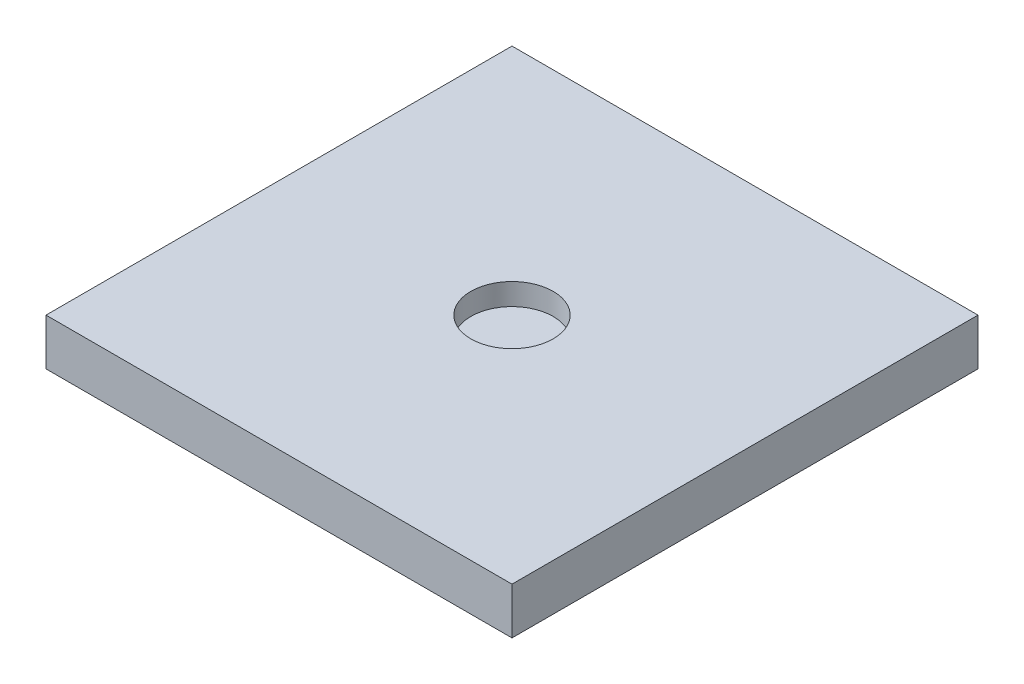
ISO-10303-21;
HEADER;
FILE_DESCRIPTION(('STEP AP214'),'2;1');
FILE_NAME('part.step','',(''),(''),'','','');
FILE_SCHEMA(('AUTOMOTIVE_DESIGN { 1 0 10303 214 1 1 1 1 }'));
ENDSEC;
DATA;
#1=APPLICATION_CONTEXT('core data for automotive mechanical design processes');
#2=APPLICATION_PROTOCOL_DEFINITION('international standard','automotive_design',2000,#1);
#3=PRODUCT_CONTEXT('',#1,'mechanical');
#4=PRODUCT('Part','Part','',(#3));
#5=PRODUCT_RELATED_PRODUCT_CATEGORY('part','',(#4));
#6=PRODUCT_DEFINITION_FORMATION('','',#4);
#7=PRODUCT_DEFINITION_CONTEXT('part definition',#1,'design');
#8=PRODUCT_DEFINITION('design','',#6,#7);
#9=PRODUCT_DEFINITION_SHAPE('','',#8);
#10=(LENGTH_UNIT() NAMED_UNIT(*) SI_UNIT(.MILLI.,.METRE.));
#11=(NAMED_UNIT(*) PLANE_ANGLE_UNIT() SI_UNIT($,.RADIAN.));
#12=(NAMED_UNIT(*) SI_UNIT($,.STERADIAN.) SOLID_ANGLE_UNIT());
#13=UNCERTAINTY_MEASURE_WITH_UNIT(LENGTH_MEASURE(1.E-05),#10,'distance_accuracy_value','');
#14=(GEOMETRIC_REPRESENTATION_CONTEXT(3) GLOBAL_UNCERTAINTY_ASSIGNED_CONTEXT((#13)) GLOBAL_UNIT_ASSIGNED_CONTEXT((#10,
#11,#12)) REPRESENTATION_CONTEXT('',''));
#15=CARTESIAN_POINT('',(0.,0.,0.));
#16=DIRECTION('',(0.,0.,1.));
#17=DIRECTION('',(1.,0.,0.));
#18=AXIS2_PLACEMENT_3D('',#15,#16,#17);
#19=CARTESIAN_POINT('',(0.,15.,0.));
#20=DIRECTION('',(0.,-1.,0.));
#21=DIRECTION('',(0.,0.,-1.));
#22=AXIS2_PLACEMENT_3D('',#19,#20,#21);
#23=CYLINDRICAL_SURFACE('',#22,13.25);
#24=CARTESIAN_POINT('',(0.,15.,0.));
#25=DIRECTION('',(0.,1.,0.));
#26=DIRECTION('',(0.,0.,1.));
#27=AXIS2_PLACEMENT_3D('',#24,#25,#26);
#28=CIRCLE('',#27,13.25);
#29=CARTESIAN_POINT('',(0.,15.,13.25));
#30=VERTEX_POINT('',#29);
#31=EDGE_CURVE('E101',#30,#30,#28,.T.);
#32=ORIENTED_EDGE('',*,*,#31,.T.);
#33=EDGE_LOOP('',(#32));
#34=FACE_BOUND('',#33,.T.);
#35=CARTESIAN_POINT('',(0.,8.,0.));
#36=DIRECTION('',(0.,-1.,0.));
#37=DIRECTION('',(0.,0.,-1.));
#38=AXIS2_PLACEMENT_3D('',#35,#36,#37);
#39=CIRCLE('',#38,13.25);
#40=CARTESIAN_POINT('',(0.,8.,-13.25));
#41=VERTEX_POINT('',#40);
#42=EDGE_CURVE('E114',#41,#41,#39,.T.);
#43=ORIENTED_EDGE('',*,*,#42,.T.);
#44=EDGE_LOOP('',(#43));
#45=FACE_BOUND('',#44,.T.);
#46=ADVANCED_FACE('F33',(#34,#45),#23,.F.);
#47=CARTESIAN_POINT('',(0.,15.,0.));
#48=DIRECTION('',(0.,-1.,0.));
#49=DIRECTION('',(0.,0.,-1.));
#50=AXIS2_PLACEMENT_3D('',#47,#48,#49);
#51=PLANE('',#50);
#52=DIRECTION('',(0.,0.,-1.));
#53=VECTOR('',#52,1.);
#54=CARTESIAN_POINT('',(75.,15.,75.));
#55=LINE('',#54,#53);
#56=CARTESIAN_POINT('',(75.,15.,75.));
#57=VERTEX_POINT('',#56);
#58=CARTESIAN_POINT('',(75.,15.,-75.));
#59=VERTEX_POINT('',#58);
#60=EDGE_CURVE('E86',#57,#59,#55,.T.);
#61=ORIENTED_EDGE('',*,*,#60,.T.);
#62=DIRECTION('',(-1.,0.,0.));
#63=VECTOR('',#62,1.);
#64=CARTESIAN_POINT('',(-75.,15.,-75.));
#65=LINE('',#64,#63);
#66=CARTESIAN_POINT('',(-75.,15.,-75.));
#67=VERTEX_POINT('',#66);
#68=EDGE_CURVE('E80',#59,#67,#65,.T.);
#69=ORIENTED_EDGE('',*,*,#68,.T.);
#70=DIRECTION('',(0.,0.,1.));
#71=VECTOR('',#70,1.);
#72=CARTESIAN_POINT('',(-75.,15.,75.));
#73=LINE('',#72,#71);
#74=CARTESIAN_POINT('',(-75.,15.,75.));
#75=VERTEX_POINT('',#74);
#76=EDGE_CURVE('E84',#67,#75,#73,.T.);
#77=ORIENTED_EDGE('',*,*,#76,.T.);
#78=DIRECTION('',(1.,0.,0.));
#79=VECTOR('',#78,1.);
#80=CARTESIAN_POINT('',(-75.,15.,75.));
#81=LINE('',#80,#79);
#82=EDGE_CURVE('E50',#75,#57,#81,.T.);
#83=ORIENTED_EDGE('',*,*,#82,.T.);
#84=EDGE_LOOP('',(#61,#69,#77,#83));
#85=FACE_BOUND('',#84,.T.);
#86=ORIENTED_EDGE('',*,*,#31,.F.);
#87=EDGE_LOOP('',(#86));
#88=FACE_BOUND('',#87,.T.);
#89=ADVANCED_FACE('F81',(#85,#88),#51,.F.);
#90=CARTESIAN_POINT('',(0.,0.,0.));
#91=DIRECTION('',(0.,-1.,0.));
#92=DIRECTION('',(0.,0.,-1.));
#93=AXIS2_PLACEMENT_3D('',#90,#91,#92);
#94=PLANE('',#93);
#95=DIRECTION('',(0.,0.,-1.));
#96=VECTOR('',#95,1.);
#97=CARTESIAN_POINT('',(75.,0.,75.));
#98=LINE('',#97,#96);
#99=CARTESIAN_POINT('',(75.,0.,75.));
#100=VERTEX_POINT('',#99);
#101=CARTESIAN_POINT('',(75.,0.,-75.));
#102=VERTEX_POINT('',#101);
#103=EDGE_CURVE('E98',#100,#102,#98,.T.);
#104=ORIENTED_EDGE('',*,*,#103,.F.);
#105=DIRECTION('',(1.,0.,0.));
#106=VECTOR('',#105,1.);
#107=CARTESIAN_POINT('',(-75.,0.,75.));
#108=LINE('',#107,#106);
#109=CARTESIAN_POINT('',(-75.,0.,75.));
#110=VERTEX_POINT('',#109);
#111=EDGE_CURVE('E73',#110,#100,#108,.T.);
#112=ORIENTED_EDGE('',*,*,#111,.F.);
#113=DIRECTION('',(0.,0.,1.));
#114=VECTOR('',#113,1.);
#115=CARTESIAN_POINT('',(-75.,0.,75.));
#116=LINE('',#115,#114);
#117=CARTESIAN_POINT('',(-75.,0.,-75.));
#118=VERTEX_POINT('',#117);
#119=EDGE_CURVE('E67',#118,#110,#116,.T.);
#120=ORIENTED_EDGE('',*,*,#119,.F.);
#121=DIRECTION('',(-1.,0.,0.));
#122=VECTOR('',#121,1.);
#123=CARTESIAN_POINT('',(-75.,0.,-75.));
#124=LINE('',#123,#122);
#125=EDGE_CURVE('E90',#102,#118,#124,.T.);
#126=ORIENTED_EDGE('',*,*,#125,.F.);
#127=EDGE_LOOP('',(#104,#112,#120,#126));
#128=FACE_BOUND('',#127,.T.);
#129=ADVANCED_FACE('F109',(#128),#94,.T.);
#130=CARTESIAN_POINT('',(75.,15.,75.));
#131=DIRECTION('',(-1.,0.,0.));
#132=DIRECTION('',(0.,0.,1.));
#133=AXIS2_PLACEMENT_3D('',#130,#131,#132);
#134=PLANE('',#133);
#135=ORIENTED_EDGE('',*,*,#103,.T.);
#136=DIRECTION('',(0.,-1.,0.));
#137=VECTOR('',#136,1.);
#138=CARTESIAN_POINT('',(75.,15.,-75.));
#139=LINE('',#138,#137);
#140=EDGE_CURVE('E11',#59,#102,#139,.T.);
#141=ORIENTED_EDGE('',*,*,#140,.F.);
#142=ORIENTED_EDGE('',*,*,#60,.F.);
#143=DIRECTION('',(0.,-1.,0.));
#144=VECTOR('',#143,1.);
#145=CARTESIAN_POINT('',(75.,15.,75.));
#146=LINE('',#145,#144);
#147=EDGE_CURVE('E94',#57,#100,#146,.T.);
#148=ORIENTED_EDGE('',*,*,#147,.T.);
#149=EDGE_LOOP('',(#135,#141,#142,#148));
#150=FACE_BOUND('',#149,.T.);
#151=ADVANCED_FACE('F35',(#150),#134,.F.);
#152=CARTESIAN_POINT('',(-75.,15.,-75.));
#153=DIRECTION('',(0.,0.,1.));
#154=DIRECTION('',(1.,0.,0.));
#155=AXIS2_PLACEMENT_3D('',#152,#153,#154);
#156=PLANE('',#155);
#157=ORIENTED_EDGE('',*,*,#125,.T.);
#158=DIRECTION('',(0.,-1.,0.));
#159=VECTOR('',#158,1.);
#160=CARTESIAN_POINT('',(-75.,15.,-75.));
#161=LINE('',#160,#159);
#162=EDGE_CURVE('E42',#67,#118,#161,.T.);
#163=ORIENTED_EDGE('',*,*,#162,.F.);
#164=ORIENTED_EDGE('',*,*,#68,.F.);
#165=ORIENTED_EDGE('',*,*,#140,.T.);
#166=EDGE_LOOP('',(#157,#163,#164,#165));
#167=FACE_BOUND('',#166,.T.);
#168=ADVANCED_FACE('F89',(#167),#156,.F.);
#169=CARTESIAN_POINT('',(-75.,15.,75.));
#170=DIRECTION('',(1.,0.,0.));
#171=DIRECTION('',(0.,0.,-1.));
#172=AXIS2_PLACEMENT_3D('',#169,#170,#171);
#173=PLANE('',#172);
#174=ORIENTED_EDGE('',*,*,#119,.T.);
#175=DIRECTION('',(0.,-1.,0.));
#176=VECTOR('',#175,1.);
#177=CARTESIAN_POINT('',(-75.,15.,75.));
#178=LINE('',#177,#176);
#179=EDGE_CURVE('E91',#75,#110,#178,.T.);
#180=ORIENTED_EDGE('',*,*,#179,.F.);
#181=ORIENTED_EDGE('',*,*,#76,.F.);
#182=ORIENTED_EDGE('',*,*,#162,.T.);
#183=EDGE_LOOP('',(#174,#180,#181,#182));
#184=FACE_BOUND('',#183,.T.);
#185=ADVANCED_FACE('F92',(#184),#173,.F.);
#186=CARTESIAN_POINT('',(-75.,15.,75.));
#187=DIRECTION('',(0.,0.,-1.));
#188=DIRECTION('',(-1.,0.,0.));
#189=AXIS2_PLACEMENT_3D('',#186,#187,#188);
#190=PLANE('',#189);
#191=ORIENTED_EDGE('',*,*,#111,.T.);
#192=ORIENTED_EDGE('',*,*,#147,.F.);
#193=ORIENTED_EDGE('',*,*,#82,.F.);
#194=ORIENTED_EDGE('',*,*,#179,.T.);
#195=EDGE_LOOP('',(#191,#192,#193,#194));
#196=FACE_BOUND('',#195,.T.);
#197=ADVANCED_FACE('F106',(#196),#190,.F.);
#198=CARTESIAN_POINT('',(0.,8.,0.));
#199=DIRECTION('',(0.,-1.,0.));
#200=DIRECTION('',(0.,0.,-1.));
#201=AXIS2_PLACEMENT_3D('',#198,#199,#200);
#202=PLANE('',#201);
#203=ORIENTED_EDGE('',*,*,#42,.F.);
#204=EDGE_LOOP('',(#203));
#205=FACE_BOUND('',#204,.T.);
#206=ADVANCED_FACE('F119',(#205),#202,.F.);
#207=CLOSED_SHELL('',(#46,#89,#129,#151,#168,#185,#197,#206));
#208=MANIFOLD_SOLID_BREP('B2',#207);
#209=ADVANCED_BREP_SHAPE_REPRESENTATION('',(#18,#208),#14);
#210=SHAPE_DEFINITION_REPRESENTATION(#9,#209);
ENDSEC;
END-ISO-10303-21;
